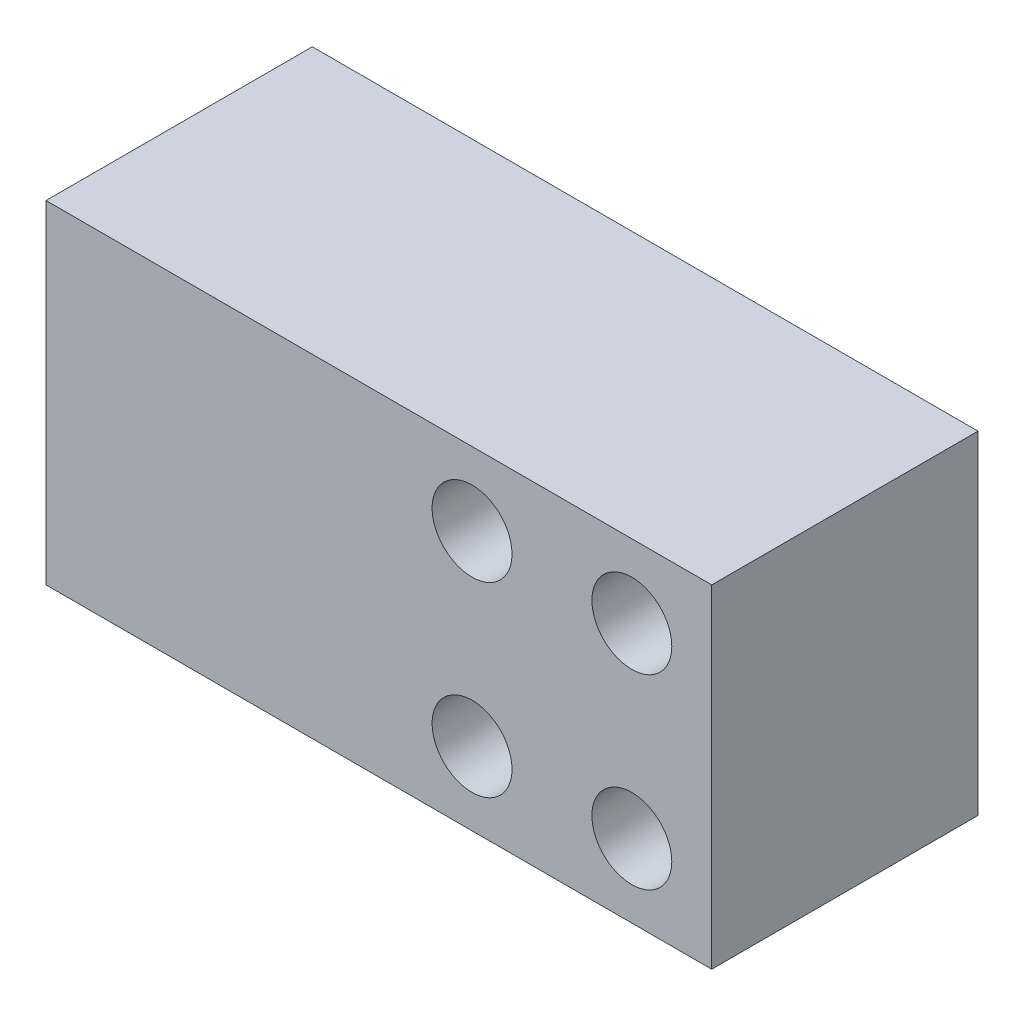
ISO-10303-21;
HEADER;
FILE_DESCRIPTION(('STEP AP214'),'2;1');
FILE_NAME('part.step','',(''),(''),'','','');
FILE_SCHEMA(('AUTOMOTIVE_DESIGN { 1 0 10303 214 1 1 1 1 }'));
ENDSEC;
DATA;
#1=APPLICATION_CONTEXT('core data for automotive mechanical design processes');
#2=APPLICATION_PROTOCOL_DEFINITION('international standard','automotive_design',2000,#1);
#3=PRODUCT_CONTEXT('',#1,'mechanical');
#4=PRODUCT('Part','Part','',(#3));
#5=PRODUCT_RELATED_PRODUCT_CATEGORY('part','',(#4));
#6=PRODUCT_DEFINITION_FORMATION('','',#4);
#7=PRODUCT_DEFINITION_CONTEXT('part definition',#1,'design');
#8=PRODUCT_DEFINITION('design','',#6,#7);
#9=PRODUCT_DEFINITION_SHAPE('','',#8);
#10=(LENGTH_UNIT() NAMED_UNIT(*) SI_UNIT(.MILLI.,.METRE.));
#11=(NAMED_UNIT(*) PLANE_ANGLE_UNIT() SI_UNIT($,.RADIAN.));
#12=(NAMED_UNIT(*) SI_UNIT($,.STERADIAN.) SOLID_ANGLE_UNIT());
#13=UNCERTAINTY_MEASURE_WITH_UNIT(LENGTH_MEASURE(1.E-05),#10,'distance_accuracy_value','');
#14=(GEOMETRIC_REPRESENTATION_CONTEXT(3) GLOBAL_UNCERTAINTY_ASSIGNED_CONTEXT((#13)) GLOBAL_UNIT_ASSIGNED_CONTEXT((#10,
#11,#12)) REPRESENTATION_CONTEXT('',''));
#15=CARTESIAN_POINT('',(0.,0.,0.));
#16=DIRECTION('',(0.,0.,1.));
#17=DIRECTION('',(1.,0.,0.));
#18=AXIS2_PLACEMENT_3D('',#15,#16,#17);
#19=CARTESIAN_POINT('',(0.,0.,20.));
#20=DIRECTION('',(1.,0.,0.));
#21=DIRECTION('',(0.,0.,-1.));
#22=AXIS2_PLACEMENT_3D('',#19,#20,#21);
#23=PLANE('',#22);
#24=DIRECTION('',(0.,-1.,0.));
#25=VECTOR('',#24,1.);
#26=CARTESIAN_POINT('',(0.,0.,0.));
#27=LINE('',#26,#25);
#28=CARTESIAN_POINT('',(0.,0.,0.));
#29=VERTEX_POINT('',#28);
#30=CARTESIAN_POINT('',(0.,-25.,0.));
#31=VERTEX_POINT('',#30);
#32=EDGE_CURVE('E107',#29,#31,#27,.T.);
#33=ORIENTED_EDGE('',*,*,#32,.T.);
#34=DIRECTION('',(0.,0.,-1.));
#35=VECTOR('',#34,1.);
#36=CARTESIAN_POINT('',(0.,-25.,20.));
#37=LINE('',#36,#35);
#38=CARTESIAN_POINT('',(0.,-25.,20.));
#39=VERTEX_POINT('',#38);
#40=EDGE_CURVE('E11',#39,#31,#37,.T.);
#41=ORIENTED_EDGE('',*,*,#40,.F.);
#42=DIRECTION('',(0.,-1.,0.));
#43=VECTOR('',#42,1.);
#44=CARTESIAN_POINT('',(0.,0.,20.));
#45=LINE('',#44,#43);
#46=CARTESIAN_POINT('',(0.,0.,20.));
#47=VERTEX_POINT('',#46);
#48=EDGE_CURVE('E94',#47,#39,#45,.T.);
#49=ORIENTED_EDGE('',*,*,#48,.F.);
#50=DIRECTION('',(0.,0.,-1.));
#51=VECTOR('',#50,1.);
#52=CARTESIAN_POINT('',(0.,0.,20.));
#53=LINE('',#52,#51);
#54=EDGE_CURVE('E103',#47,#29,#53,.T.);
#55=ORIENTED_EDGE('',*,*,#54,.T.);
#56=EDGE_LOOP('',(#33,#41,#49,#55));
#57=FACE_BOUND('',#56,.T.);
#58=ADVANCED_FACE('F41',(#57),#23,.F.);
#59=CARTESIAN_POINT('',(0.,-25.,20.));
#60=DIRECTION('',(0.,1.,0.));
#61=DIRECTION('',(0.,0.,1.));
#62=AXIS2_PLACEMENT_3D('',#59,#60,#61);
#63=PLANE('',#62);
#64=DIRECTION('',(1.,0.,0.));
#65=VECTOR('',#64,1.);
#66=CARTESIAN_POINT('',(0.,-25.,0.));
#67=LINE('',#66,#65);
#68=CARTESIAN_POINT('',(50.,-25.,0.));
#69=VERTEX_POINT('',#68);
#70=EDGE_CURVE('E98',#31,#69,#67,.T.);
#71=ORIENTED_EDGE('',*,*,#70,.T.);
#72=DIRECTION('',(0.,0.,-1.));
#73=VECTOR('',#72,1.);
#74=CARTESIAN_POINT('',(50.,-25.,20.));
#75=LINE('',#74,#73);
#76=CARTESIAN_POINT('',(50.,-25.,20.));
#77=VERTEX_POINT('',#76);
#78=EDGE_CURVE('E50',#77,#69,#75,.T.);
#79=ORIENTED_EDGE('',*,*,#78,.F.);
#80=DIRECTION('',(1.,0.,0.));
#81=VECTOR('',#80,1.);
#82=CARTESIAN_POINT('',(0.,-25.,20.));
#83=LINE('',#82,#81);
#84=EDGE_CURVE('E89',#39,#77,#83,.T.);
#85=ORIENTED_EDGE('',*,*,#84,.F.);
#86=ORIENTED_EDGE('',*,*,#40,.T.);
#87=EDGE_LOOP('',(#71,#79,#85,#86));
#88=FACE_BOUND('',#87,.T.);
#89=ADVANCED_FACE('F97',(#88),#63,.F.);
#90=CARTESIAN_POINT('',(50.,0.,20.));
#91=DIRECTION('',(-1.,0.,0.));
#92=DIRECTION('',(0.,0.,1.));
#93=AXIS2_PLACEMENT_3D('',#90,#91,#92);
#94=PLANE('',#93);
#95=DIRECTION('',(0.,1.,0.));
#96=VECTOR('',#95,1.);
#97=CARTESIAN_POINT('',(50.,0.,0.));
#98=LINE('',#97,#96);
#99=CARTESIAN_POINT('',(50.,0.,0.));
#100=VERTEX_POINT('',#99);
#101=EDGE_CURVE('E76',#69,#100,#98,.T.);
#102=ORIENTED_EDGE('',*,*,#101,.T.);
#103=DIRECTION('',(0.,0.,-1.));
#104=VECTOR('',#103,1.);
#105=CARTESIAN_POINT('',(50.,0.,20.));
#106=LINE('',#105,#104);
#107=CARTESIAN_POINT('',(50.,0.,20.));
#108=VERTEX_POINT('',#107);
#109=EDGE_CURVE('E99',#108,#100,#106,.T.);
#110=ORIENTED_EDGE('',*,*,#109,.F.);
#111=DIRECTION('',(0.,1.,0.));
#112=VECTOR('',#111,1.);
#113=CARTESIAN_POINT('',(50.,0.,20.));
#114=LINE('',#113,#112);
#115=EDGE_CURVE('E92',#77,#108,#114,.T.);
#116=ORIENTED_EDGE('',*,*,#115,.F.);
#117=ORIENTED_EDGE('',*,*,#78,.T.);
#118=EDGE_LOOP('',(#102,#110,#116,#117));
#119=FACE_BOUND('',#118,.T.);
#120=ADVANCED_FACE('F101',(#119),#94,.F.);
#121=CARTESIAN_POINT('',(0.,0.,20.));
#122=DIRECTION('',(0.,-1.,0.));
#123=DIRECTION('',(0.,0.,-1.));
#124=AXIS2_PLACEMENT_3D('',#121,#122,#123);
#125=PLANE('',#124);
#126=DIRECTION('',(-1.,0.,0.));
#127=VECTOR('',#126,1.);
#128=CARTESIAN_POINT('',(0.,0.,0.));
#129=LINE('',#128,#127);
#130=EDGE_CURVE('E82',#100,#29,#129,.T.);
#131=ORIENTED_EDGE('',*,*,#130,.T.);
#132=ORIENTED_EDGE('',*,*,#54,.F.);
#133=DIRECTION('',(-1.,0.,0.));
#134=VECTOR('',#133,1.);
#135=CARTESIAN_POINT('',(0.,0.,20.));
#136=LINE('',#135,#134);
#137=EDGE_CURVE('E59',#108,#47,#136,.T.);
#138=ORIENTED_EDGE('',*,*,#137,.F.);
#139=ORIENTED_EDGE('',*,*,#109,.T.);
#140=EDGE_LOOP('',(#131,#132,#138,#139));
#141=FACE_BOUND('',#140,.T.);
#142=ADVANCED_FACE('F158',(#141),#125,.F.);
#143=CARTESIAN_POINT('',(0.,0.,20.));
#144=DIRECTION('',(0.,0.,1.));
#145=DIRECTION('',(1.,0.,0.));
#146=AXIS2_PLACEMENT_3D('',#143,#144,#145);
#147=PLANE('',#146);
#148=CARTESIAN_POINT('',(43.9999999999999,-19.5,20.));
#149=DIRECTION('',(0.,0.,1.));
#150=DIRECTION('',(-1.,0.,0.));
#151=AXIS2_PLACEMENT_3D('',#148,#149,#150);
#152=CIRCLE('',#151,3.);
#153=CARTESIAN_POINT('',(46.9999999999999,-19.5,20.));
#154=VERTEX_POINT('',#153);
#155=EDGE_CURVE('E227',#154,#154,#152,.T.);
#156=ORIENTED_EDGE('',*,*,#155,.F.);
#157=EDGE_LOOP('',(#156));
#158=FACE_BOUND('',#157,.T.);
#159=CARTESIAN_POINT('',(31.9999999999999,-5.50000000000009,20.));
#160=DIRECTION('',(0.,0.,1.));
#161=DIRECTION('',(1.,0.,0.));
#162=AXIS2_PLACEMENT_3D('',#159,#160,#161);
#163=CIRCLE('',#162,3.00000000000001);
#164=CARTESIAN_POINT('',(34.9999999999999,-5.50000000000009,20.));
#165=VERTEX_POINT('',#164);
#166=EDGE_CURVE('E222',#165,#165,#163,.T.);
#167=ORIENTED_EDGE('',*,*,#166,.F.);
#168=EDGE_LOOP('',(#167));
#169=FACE_BOUND('',#168,.T.);
#170=CARTESIAN_POINT('',(31.9999999999999,-19.4999999999999,20.));
#171=DIRECTION('',(0.,0.,1.));
#172=DIRECTION('',(-1.,0.,0.));
#173=AXIS2_PLACEMENT_3D('',#170,#171,#172);
#174=CIRCLE('',#173,3.00000000000001);
#175=CARTESIAN_POINT('',(34.9999999999999,-19.4999999999999,20.));
#176=VERTEX_POINT('',#175);
#177=EDGE_CURVE('E215',#176,#176,#174,.T.);
#178=ORIENTED_EDGE('',*,*,#177,.F.);
#179=EDGE_LOOP('',(#178));
#180=FACE_BOUND('',#179,.T.);
#181=CARTESIAN_POINT('',(43.9999999999999,-5.5,20.));
#182=DIRECTION('',(0.,0.,1.));
#183=DIRECTION('',(1.,0.,0.));
#184=AXIS2_PLACEMENT_3D('',#181,#182,#183);
#185=CIRCLE('',#184,3.);
#186=CARTESIAN_POINT('',(46.9999999999999,-5.5,20.));
#187=VERTEX_POINT('',#186);
#188=EDGE_CURVE('E119',#187,#187,#185,.T.);
#189=ORIENTED_EDGE('',*,*,#188,.F.);
#190=EDGE_LOOP('',(#189));
#191=FACE_BOUND('',#190,.T.);
#192=ORIENTED_EDGE('',*,*,#48,.T.);
#193=ORIENTED_EDGE('',*,*,#84,.T.);
#194=ORIENTED_EDGE('',*,*,#115,.T.);
#195=ORIENTED_EDGE('',*,*,#137,.T.);
#196=EDGE_LOOP('',(#192,#193,#194,#195));
#197=FACE_BOUND('',#196,.T.);
#198=ADVANCED_FACE('F90',(#158,#169,#180,#191,#197),#147,.T.);
#199=CARTESIAN_POINT('',(0.,0.,0.));
#200=DIRECTION('',(0.,0.,1.));
#201=DIRECTION('',(1.,0.,0.));
#202=AXIS2_PLACEMENT_3D('',#199,#200,#201);
#203=PLANE('',#202);
#204=CARTESIAN_POINT('',(43.9999999999999,-19.5,0.));
#205=DIRECTION('',(0.,0.,1.));
#206=DIRECTION('',(1.,0.,0.));
#207=AXIS2_PLACEMENT_3D('',#204,#205,#206);
#208=CIRCLE('',#207,3.);
#209=CARTESIAN_POINT('',(46.9999999999999,-19.5,0.));
#210=VERTEX_POINT('',#209);
#211=EDGE_CURVE('E44',#210,#210,#208,.T.);
#212=ORIENTED_EDGE('',*,*,#211,.T.);
#213=EDGE_LOOP('',(#212));
#214=FACE_BOUND('',#213,.T.);
#215=CARTESIAN_POINT('',(31.9999999999999,-5.50000000000009,0.));
#216=DIRECTION('',(0.,0.,1.));
#217=DIRECTION('',(1.,0.,0.));
#218=AXIS2_PLACEMENT_3D('',#215,#216,#217);
#219=CIRCLE('',#218,3.00000000000001);
#220=CARTESIAN_POINT('',(34.9999999999999,-5.50000000000009,0.));
#221=VERTEX_POINT('',#220);
#222=EDGE_CURVE('E121',#221,#221,#219,.T.);
#223=ORIENTED_EDGE('',*,*,#222,.T.);
#224=EDGE_LOOP('',(#223));
#225=FACE_BOUND('',#224,.T.);
#226=CARTESIAN_POINT('',(31.9999999999999,-19.4999999999999,0.));
#227=DIRECTION('',(0.,0.,1.));
#228=DIRECTION('',(1.,0.,0.));
#229=AXIS2_PLACEMENT_3D('',#226,#227,#228);
#230=CIRCLE('',#229,3.00000000000001);
#231=CARTESIAN_POINT('',(34.9999999999999,-19.4999999999999,0.));
#232=VERTEX_POINT('',#231);
#233=EDGE_CURVE('E118',#232,#232,#230,.T.);
#234=ORIENTED_EDGE('',*,*,#233,.T.);
#235=EDGE_LOOP('',(#234));
#236=FACE_BOUND('',#235,.T.);
#237=CARTESIAN_POINT('',(43.9999999999999,-5.5,0.));
#238=DIRECTION('',(0.,0.,1.));
#239=DIRECTION('',(1.,0.,0.));
#240=AXIS2_PLACEMENT_3D('',#237,#238,#239);
#241=CIRCLE('',#240,3.);
#242=CARTESIAN_POINT('',(46.9999999999999,-5.5,0.));
#243=VERTEX_POINT('',#242);
#244=EDGE_CURVE('E115',#243,#243,#241,.T.);
#245=ORIENTED_EDGE('',*,*,#244,.T.);
#246=EDGE_LOOP('',(#245));
#247=FACE_BOUND('',#246,.T.);
#248=ORIENTED_EDGE('',*,*,#32,.F.);
#249=ORIENTED_EDGE('',*,*,#130,.F.);
#250=ORIENTED_EDGE('',*,*,#101,.F.);
#251=ORIENTED_EDGE('',*,*,#70,.F.);
#252=EDGE_LOOP('',(#248,#249,#250,#251));
#253=FACE_BOUND('',#252,.T.);
#254=ADVANCED_FACE('F128',(#214,#225,#236,#247,#253),#203,.F.);
#255=CARTESIAN_POINT('',(43.9999999999999,-5.5,-25.));
#256=DIRECTION('',(0.,0.,1.));
#257=DIRECTION('',(1.,0.,0.));
#258=AXIS2_PLACEMENT_3D('',#255,#256,#257);
#259=CYLINDRICAL_SURFACE('',#258,3.);
#260=CARTESIAN_POINT('',(46.9999999999999,-5.5,20.));
#261=CARTESIAN_POINT('',(46.9999999999999,-5.5,19.7916666666667));
#262=CARTESIAN_POINT('',(46.9999999999999,-5.5,19.5833333333333));
#263=CARTESIAN_POINT('',(46.9999999999999,-5.5,19.1666666666667));
#264=CARTESIAN_POINT('',(46.9999999999999,-5.5,18.9583333333333));
#265=CARTESIAN_POINT('',(46.9999999999999,-5.5,18.5416666666667));
#266=CARTESIAN_POINT('',(46.9999999999999,-5.5,18.3333333333333));
#267=CARTESIAN_POINT('',(46.9999999999999,-5.5,17.9166666666667));
#268=CARTESIAN_POINT('',(46.9999999999999,-5.5,17.7083333333333));
#269=CARTESIAN_POINT('',(46.9999999999999,-5.5,17.2916666666667));
#270=CARTESIAN_POINT('',(46.9999999999999,-5.5,17.0833333333333));
#271=CARTESIAN_POINT('',(46.9999999999999,-5.5,16.6666666666667));
#272=CARTESIAN_POINT('',(46.9999999999999,-5.5,16.4583333333333));
#273=CARTESIAN_POINT('',(46.9999999999999,-5.5,16.0416666666667));
#274=CARTESIAN_POINT('',(46.9999999999999,-5.5,15.8333333333333));
#275=CARTESIAN_POINT('',(46.9999999999999,-5.5,15.4166666666667));
#276=CARTESIAN_POINT('',(46.9999999999999,-5.5,15.2083333333333));
#277=CARTESIAN_POINT('',(46.9999999999999,-5.5,14.7916666666667));
#278=CARTESIAN_POINT('',(46.9999999999999,-5.5,14.5833333333333));
#279=CARTESIAN_POINT('',(46.9999999999999,-5.5,14.1666666666667));
#280=CARTESIAN_POINT('',(46.9999999999999,-5.5,13.9583333333333));
#281=CARTESIAN_POINT('',(46.9999999999999,-5.5,13.5416666666667));
#282=CARTESIAN_POINT('',(46.9999999999999,-5.5,13.3333333333333));
#283=CARTESIAN_POINT('',(46.9999999999999,-5.5,12.9166666666667));
#284=CARTESIAN_POINT('',(46.9999999999999,-5.5,12.7083333333333));
#285=CARTESIAN_POINT('',(46.9999999999999,-5.5,12.2916666666667));
#286=CARTESIAN_POINT('',(46.9999999999999,-5.5,12.0833333333333));
#287=CARTESIAN_POINT('',(46.9999999999999,-5.5,11.6666666666667));
#288=CARTESIAN_POINT('',(46.9999999999999,-5.5,11.4583333333333));
#289=CARTESIAN_POINT('',(46.9999999999999,-5.5,11.0416666666667));
#290=CARTESIAN_POINT('',(46.9999999999999,-5.5,10.8333333333333));
#291=CARTESIAN_POINT('',(46.9999999999999,-5.5,10.4166666666667));
#292=CARTESIAN_POINT('',(46.9999999999999,-5.5,10.2083333333333));
#293=CARTESIAN_POINT('',(46.9999999999999,-5.5,9.79166666666667));
#294=CARTESIAN_POINT('',(46.9999999999999,-5.5,9.58333333333333));
#295=CARTESIAN_POINT('',(46.9999999999999,-5.5,9.16666666666666));
#296=CARTESIAN_POINT('',(46.9999999999999,-5.5,8.95833333333333));
#297=CARTESIAN_POINT('',(46.9999999999999,-5.5,8.54166666666666));
#298=CARTESIAN_POINT('',(46.9999999999999,-5.5,8.33333333333333));
#299=CARTESIAN_POINT('',(46.9999999999999,-5.5,7.91666666666666));
#300=CARTESIAN_POINT('',(46.9999999999999,-5.5,7.70833333333333));
#301=CARTESIAN_POINT('',(46.9999999999999,-5.5,7.29166666666666));
#302=CARTESIAN_POINT('',(46.9999999999999,-5.5,7.08333333333333));
#303=CARTESIAN_POINT('',(46.9999999999999,-5.5,6.66666666666666));
#304=CARTESIAN_POINT('',(46.9999999999999,-5.5,6.45833333333333));
#305=CARTESIAN_POINT('',(46.9999999999999,-5.5,6.04166666666667));
#306=CARTESIAN_POINT('',(46.9999999999999,-5.5,5.83333333333334));
#307=CARTESIAN_POINT('',(46.9999999999999,-5.5,5.41666666666667));
#308=CARTESIAN_POINT('',(46.9999999999999,-5.5,5.20833333333333));
#309=CARTESIAN_POINT('',(46.9999999999999,-5.5,4.79166666666667));
#310=CARTESIAN_POINT('',(46.9999999999999,-5.5,4.58333333333333));
#311=CARTESIAN_POINT('',(46.9999999999999,-5.5,4.16666666666667));
#312=CARTESIAN_POINT('',(46.9999999999999,-5.5,3.95833333333333));
#313=CARTESIAN_POINT('',(46.9999999999999,-5.5,3.54166666666667));
#314=CARTESIAN_POINT('',(46.9999999999999,-5.5,3.33333333333333));
#315=CARTESIAN_POINT('',(46.9999999999999,-5.5,2.91666666666667));
#316=CARTESIAN_POINT('',(46.9999999999999,-5.5,2.70833333333333));
#317=CARTESIAN_POINT('',(46.9999999999999,-5.5,2.29166666666667));
#318=CARTESIAN_POINT('',(46.9999999999999,-5.5,2.08333333333334));
#319=CARTESIAN_POINT('',(46.9999999999999,-5.5,1.66666666666667));
#320=CARTESIAN_POINT('',(46.9999999999999,-5.5,1.45833333333333));
#321=CARTESIAN_POINT('',(46.9999999999999,-5.5,1.04166666666667));
#322=CARTESIAN_POINT('',(46.9999999999999,-5.5,0.833333333333334));
#323=CARTESIAN_POINT('',(46.9999999999999,-5.5,0.416666666666667));
#324=CARTESIAN_POINT('',(46.9999999999999,-5.5,0.208333333333334));
#325=CARTESIAN_POINT('',(46.9999999999999,-5.5,0.));
#326=B_SPLINE_CURVE_WITH_KNOTS('',3,(#260,#261,#262,#263,#264,#265,#266,#267,#268,#269,#270,
#271,#272,#273,#274,#275,#276,#277,#278,#279,#280,#281,#282,#283,#284,#285,#286,#287,#288,#289,
#290,#291,#292,#293,#294,#295,#296,#297,#298,#299,#300,#301,#302,#303,#304,#305,#306,#307,#308,
#309,#310,#311,#312,#313,#314,#315,#316,#317,#318,#319,#320,#321,#322,#323,#324,#325),
.UNSPECIFIED.,.F.,.F.,(4,2,2,2,2,2,2,2,2,2,2,2,2,2,2,2,2,2,2,2,2,2,2,2,2,2,2,2,2,2,2,2,4),(0.,
0.625000000000001,1.25,1.875,2.5,3.125,3.75,4.375,5.,5.62500000000001,6.25,6.875,7.5,8.125,8.75,
9.375,10.,10.625,11.25,11.875,12.5,13.125,13.75,14.375,15.,15.625,16.25,16.875,17.5,18.125,
18.75,19.375,20.),.UNSPECIFIED.);
#327=EDGE_CURVE('BSEAM151',#187,#243,#326,.T.);
#328=ORIENTED_EDGE('',*,*,#188,.T.);
#329=ORIENTED_EDGE('',*,*,#244,.F.);
#330=ORIENTED_EDGE('',*,*,#327,.T.);
#331=ORIENTED_EDGE('',*,*,#327,.F.);
#332=EDGE_LOOP('',(#328,#330,#329,#331));
#333=FACE_BOUND('',#332,.T.);
#334=ADVANCED_FACE('F151',(#333),#259,.F.);
#335=CARTESIAN_POINT('',(31.9999999999999,-19.4999999999999,-25.));
#336=DIRECTION('',(0.,0.,1.));
#337=DIRECTION('',(1.,0.,0.));
#338=AXIS2_PLACEMENT_3D('',#335,#336,#337);
#339=CYLINDRICAL_SURFACE('',#338,3.00000000000001);
#340=CARTESIAN_POINT('',(34.9999999999999,-19.4999999999999,20.));
#341=CARTESIAN_POINT('',(34.9999999999999,-19.4999999999999,19.7916666666667));
#342=CARTESIAN_POINT('',(34.9999999999999,-19.4999999999999,19.5833333333333));
#343=CARTESIAN_POINT('',(34.9999999999999,-19.4999999999999,19.1666666666667));
#344=CARTESIAN_POINT('',(34.9999999999999,-19.4999999999999,18.9583333333333));
#345=CARTESIAN_POINT('',(34.9999999999999,-19.4999999999999,18.5416666666667));
#346=CARTESIAN_POINT('',(34.9999999999999,-19.4999999999999,18.3333333333333));
#347=CARTESIAN_POINT('',(34.9999999999999,-19.4999999999999,17.9166666666667));
#348=CARTESIAN_POINT('',(34.9999999999999,-19.4999999999999,17.7083333333333));
#349=CARTESIAN_POINT('',(34.9999999999999,-19.4999999999999,17.2916666666667));
#350=CARTESIAN_POINT('',(34.9999999999999,-19.4999999999999,17.0833333333333));
#351=CARTESIAN_POINT('',(34.9999999999999,-19.4999999999999,16.6666666666667));
#352=CARTESIAN_POINT('',(34.9999999999999,-19.4999999999999,16.4583333333333));
#353=CARTESIAN_POINT('',(34.9999999999999,-19.4999999999999,16.0416666666667));
#354=CARTESIAN_POINT('',(34.9999999999999,-19.4999999999999,15.8333333333333));
#355=CARTESIAN_POINT('',(34.9999999999999,-19.4999999999999,15.4166666666667));
#356=CARTESIAN_POINT('',(34.9999999999999,-19.4999999999999,15.2083333333333));
#357=CARTESIAN_POINT('',(34.9999999999999,-19.4999999999999,14.7916666666667));
#358=CARTESIAN_POINT('',(34.9999999999999,-19.4999999999999,14.5833333333333));
#359=CARTESIAN_POINT('',(34.9999999999999,-19.4999999999999,14.1666666666667));
#360=CARTESIAN_POINT('',(34.9999999999999,-19.4999999999999,13.9583333333333));
#361=CARTESIAN_POINT('',(34.9999999999999,-19.4999999999999,13.5416666666667));
#362=CARTESIAN_POINT('',(34.9999999999999,-19.4999999999999,13.3333333333333));
#363=CARTESIAN_POINT('',(34.9999999999999,-19.4999999999999,12.9166666666667));
#364=CARTESIAN_POINT('',(34.9999999999999,-19.4999999999999,12.7083333333333));
#365=CARTESIAN_POINT('',(34.9999999999999,-19.4999999999999,12.2916666666667));
#366=CARTESIAN_POINT('',(34.9999999999999,-19.4999999999999,12.0833333333333));
#367=CARTESIAN_POINT('',(34.9999999999999,-19.4999999999999,11.6666666666667));
#368=CARTESIAN_POINT('',(34.9999999999999,-19.4999999999999,11.4583333333333));
#369=CARTESIAN_POINT('',(34.9999999999999,-19.4999999999999,11.0416666666667));
#370=CARTESIAN_POINT('',(34.9999999999999,-19.4999999999999,10.8333333333333));
#371=CARTESIAN_POINT('',(34.9999999999999,-19.4999999999999,10.4166666666667));
#372=CARTESIAN_POINT('',(34.9999999999999,-19.4999999999999,10.2083333333333));
#373=CARTESIAN_POINT('',(34.9999999999999,-19.4999999999999,9.79166666666667));
#374=CARTESIAN_POINT('',(34.9999999999999,-19.4999999999999,9.58333333333333));
#375=CARTESIAN_POINT('',(34.9999999999999,-19.4999999999999,9.16666666666666));
#376=CARTESIAN_POINT('',(34.9999999999999,-19.4999999999999,8.95833333333333));
#377=CARTESIAN_POINT('',(34.9999999999999,-19.4999999999999,8.54166666666666));
#378=CARTESIAN_POINT('',(34.9999999999999,-19.4999999999999,8.33333333333333));
#379=CARTESIAN_POINT('',(34.9999999999999,-19.4999999999999,7.91666666666666));
#380=CARTESIAN_POINT('',(34.9999999999999,-19.4999999999999,7.70833333333333));
#381=CARTESIAN_POINT('',(34.9999999999999,-19.4999999999999,7.29166666666666));
#382=CARTESIAN_POINT('',(34.9999999999999,-19.4999999999999,7.08333333333333));
#383=CARTESIAN_POINT('',(34.9999999999999,-19.4999999999999,6.66666666666666));
#384=CARTESIAN_POINT('',(34.9999999999999,-19.4999999999999,6.45833333333333));
#385=CARTESIAN_POINT('',(34.9999999999999,-19.4999999999999,6.04166666666667));
#386=CARTESIAN_POINT('',(34.9999999999999,-19.4999999999999,5.83333333333334));
#387=CARTESIAN_POINT('',(34.9999999999999,-19.4999999999999,5.41666666666667));
#388=CARTESIAN_POINT('',(34.9999999999999,-19.4999999999999,5.20833333333333));
#389=CARTESIAN_POINT('',(34.9999999999999,-19.4999999999999,4.79166666666667));
#390=CARTESIAN_POINT('',(34.9999999999999,-19.4999999999999,4.58333333333333));
#391=CARTESIAN_POINT('',(34.9999999999999,-19.4999999999999,4.16666666666667));
#392=CARTESIAN_POINT('',(34.9999999999999,-19.4999999999999,3.95833333333333));
#393=CARTESIAN_POINT('',(34.9999999999999,-19.4999999999999,3.54166666666667));
#394=CARTESIAN_POINT('',(34.9999999999999,-19.4999999999999,3.33333333333333));
#395=CARTESIAN_POINT('',(34.9999999999999,-19.4999999999999,2.91666666666667));
#396=CARTESIAN_POINT('',(34.9999999999999,-19.4999999999999,2.70833333333333));
#397=CARTESIAN_POINT('',(34.9999999999999,-19.4999999999999,2.29166666666667));
#398=CARTESIAN_POINT('',(34.9999999999999,-19.4999999999999,2.08333333333334));
#399=CARTESIAN_POINT('',(34.9999999999999,-19.4999999999999,1.66666666666667));
#400=CARTESIAN_POINT('',(34.9999999999999,-19.4999999999999,1.45833333333333));
#401=CARTESIAN_POINT('',(34.9999999999999,-19.4999999999999,1.04166666666667));
#402=CARTESIAN_POINT('',(34.9999999999999,-19.4999999999999,0.833333333333334));
#403=CARTESIAN_POINT('',(34.9999999999999,-19.4999999999999,0.416666666666667));
#404=CARTESIAN_POINT('',(34.9999999999999,-19.4999999999999,0.208333333333334));
#405=CARTESIAN_POINT('',(34.9999999999999,-19.4999999999999,0.));
#406=B_SPLINE_CURVE_WITH_KNOTS('',3,(#340,#341,#342,#343,#344,#345,#346,#347,#348,#349,#350,
#351,#352,#353,#354,#355,#356,#357,#358,#359,#360,#361,#362,#363,#364,#365,#366,#367,#368,#369,
#370,#371,#372,#373,#374,#375,#376,#377,#378,#379,#380,#381,#382,#383,#384,#385,#386,#387,#388,
#389,#390,#391,#392,#393,#394,#395,#396,#397,#398,#399,#400,#401,#402,#403,#404,#405),
.UNSPECIFIED.,.F.,.F.,(4,2,2,2,2,2,2,2,2,2,2,2,2,2,2,2,2,2,2,2,2,2,2,2,2,2,2,2,2,2,2,2,4),(0.,
0.625000000000001,1.25,1.875,2.5,3.125,3.75,4.375,5.,5.62500000000001,6.25,6.875,7.5,8.125,8.75,
9.375,10.,10.625,11.25,11.875,12.5,13.125,13.75,14.375,15.,15.625,16.25,16.875,17.5,18.125,
18.75,19.375,20.),.UNSPECIFIED.);
#407=EDGE_CURVE('BSEAM138',#176,#232,#406,.T.);
#408=ORIENTED_EDGE('',*,*,#177,.T.);
#409=ORIENTED_EDGE('',*,*,#233,.F.);
#410=ORIENTED_EDGE('',*,*,#407,.T.);
#411=ORIENTED_EDGE('',*,*,#407,.F.);
#412=EDGE_LOOP('',(#408,#410,#409,#411));
#413=FACE_BOUND('',#412,.T.);
#414=ADVANCED_FACE('F138',(#413),#339,.F.);
#415=CARTESIAN_POINT('',(31.9999999999999,-5.50000000000009,-25.));
#416=DIRECTION('',(0.,0.,1.));
#417=DIRECTION('',(1.,0.,0.));
#418=AXIS2_PLACEMENT_3D('',#415,#416,#417);
#419=CYLINDRICAL_SURFACE('',#418,3.00000000000001);
#420=CARTESIAN_POINT('',(34.9999999999999,-5.50000000000009,20.));
#421=CARTESIAN_POINT('',(34.9999999999999,-5.50000000000009,19.7916666666667));
#422=CARTESIAN_POINT('',(34.9999999999999,-5.50000000000009,19.5833333333333));
#423=CARTESIAN_POINT('',(34.9999999999999,-5.50000000000009,19.1666666666667));
#424=CARTESIAN_POINT('',(34.9999999999999,-5.50000000000009,18.9583333333333));
#425=CARTESIAN_POINT('',(34.9999999999999,-5.50000000000009,18.5416666666667));
#426=CARTESIAN_POINT('',(34.9999999999999,-5.50000000000009,18.3333333333333));
#427=CARTESIAN_POINT('',(34.9999999999999,-5.50000000000009,17.9166666666667));
#428=CARTESIAN_POINT('',(34.9999999999999,-5.50000000000009,17.7083333333333));
#429=CARTESIAN_POINT('',(34.9999999999999,-5.50000000000009,17.2916666666667));
#430=CARTESIAN_POINT('',(34.9999999999999,-5.50000000000009,17.0833333333333));
#431=CARTESIAN_POINT('',(34.9999999999999,-5.50000000000009,16.6666666666667));
#432=CARTESIAN_POINT('',(34.9999999999999,-5.50000000000009,16.4583333333333));
#433=CARTESIAN_POINT('',(34.9999999999999,-5.50000000000009,16.0416666666667));
#434=CARTESIAN_POINT('',(34.9999999999999,-5.50000000000009,15.8333333333333));
#435=CARTESIAN_POINT('',(34.9999999999999,-5.50000000000009,15.4166666666667));
#436=CARTESIAN_POINT('',(34.9999999999999,-5.50000000000009,15.2083333333333));
#437=CARTESIAN_POINT('',(34.9999999999999,-5.50000000000009,14.7916666666667));
#438=CARTESIAN_POINT('',(34.9999999999999,-5.50000000000009,14.5833333333333));
#439=CARTESIAN_POINT('',(34.9999999999999,-5.50000000000009,14.1666666666667));
#440=CARTESIAN_POINT('',(34.9999999999999,-5.50000000000009,13.9583333333333));
#441=CARTESIAN_POINT('',(34.9999999999999,-5.50000000000009,13.5416666666667));
#442=CARTESIAN_POINT('',(34.9999999999999,-5.50000000000009,13.3333333333333));
#443=CARTESIAN_POINT('',(34.9999999999999,-5.50000000000009,12.9166666666667));
#444=CARTESIAN_POINT('',(34.9999999999999,-5.50000000000009,12.7083333333333));
#445=CARTESIAN_POINT('',(34.9999999999999,-5.50000000000009,12.2916666666667));
#446=CARTESIAN_POINT('',(34.9999999999999,-5.50000000000009,12.0833333333333));
#447=CARTESIAN_POINT('',(34.9999999999999,-5.50000000000009,11.6666666666667));
#448=CARTESIAN_POINT('',(34.9999999999999,-5.50000000000009,11.4583333333333));
#449=CARTESIAN_POINT('',(34.9999999999999,-5.50000000000009,11.0416666666667));
#450=CARTESIAN_POINT('',(34.9999999999999,-5.50000000000009,10.8333333333333));
#451=CARTESIAN_POINT('',(34.9999999999999,-5.50000000000009,10.4166666666667));
#452=CARTESIAN_POINT('',(34.9999999999999,-5.50000000000009,10.2083333333333));
#453=CARTESIAN_POINT('',(34.9999999999999,-5.50000000000009,9.79166666666667));
#454=CARTESIAN_POINT('',(34.9999999999999,-5.50000000000009,9.58333333333333));
#455=CARTESIAN_POINT('',(34.9999999999999,-5.50000000000009,9.16666666666666));
#456=CARTESIAN_POINT('',(34.9999999999999,-5.50000000000009,8.95833333333333));
#457=CARTESIAN_POINT('',(34.9999999999999,-5.50000000000009,8.54166666666666));
#458=CARTESIAN_POINT('',(34.9999999999999,-5.50000000000009,8.33333333333333));
#459=CARTESIAN_POINT('',(34.9999999999999,-5.50000000000009,7.91666666666666));
#460=CARTESIAN_POINT('',(34.9999999999999,-5.50000000000009,7.70833333333333));
#461=CARTESIAN_POINT('',(34.9999999999999,-5.50000000000009,7.29166666666666));
#462=CARTESIAN_POINT('',(34.9999999999999,-5.50000000000009,7.08333333333333));
#463=CARTESIAN_POINT('',(34.9999999999999,-5.50000000000009,6.66666666666666));
#464=CARTESIAN_POINT('',(34.9999999999999,-5.50000000000009,6.45833333333333));
#465=CARTESIAN_POINT('',(34.9999999999999,-5.50000000000009,6.04166666666667));
#466=CARTESIAN_POINT('',(34.9999999999999,-5.50000000000009,5.83333333333334));
#467=CARTESIAN_POINT('',(34.9999999999999,-5.50000000000009,5.41666666666667));
#468=CARTESIAN_POINT('',(34.9999999999999,-5.50000000000009,5.20833333333333));
#469=CARTESIAN_POINT('',(34.9999999999999,-5.50000000000009,4.79166666666667));
#470=CARTESIAN_POINT('',(34.9999999999999,-5.50000000000009,4.58333333333333));
#471=CARTESIAN_POINT('',(34.9999999999999,-5.50000000000009,4.16666666666667));
#472=CARTESIAN_POINT('',(34.9999999999999,-5.50000000000009,3.95833333333333));
#473=CARTESIAN_POINT('',(34.9999999999999,-5.50000000000009,3.54166666666667));
#474=CARTESIAN_POINT('',(34.9999999999999,-5.50000000000009,3.33333333333333));
#475=CARTESIAN_POINT('',(34.9999999999999,-5.50000000000009,2.91666666666667));
#476=CARTESIAN_POINT('',(34.9999999999999,-5.50000000000009,2.70833333333333));
#477=CARTESIAN_POINT('',(34.9999999999999,-5.50000000000009,2.29166666666667));
#478=CARTESIAN_POINT('',(34.9999999999999,-5.50000000000009,2.08333333333334));
#479=CARTESIAN_POINT('',(34.9999999999999,-5.50000000000009,1.66666666666667));
#480=CARTESIAN_POINT('',(34.9999999999999,-5.50000000000009,1.45833333333333));
#481=CARTESIAN_POINT('',(34.9999999999999,-5.50000000000009,1.04166666666667));
#482=CARTESIAN_POINT('',(34.9999999999999,-5.50000000000009,0.833333333333334));
#483=CARTESIAN_POINT('',(34.9999999999999,-5.50000000000009,0.416666666666667));
#484=CARTESIAN_POINT('',(34.9999999999999,-5.50000000000009,0.208333333333334));
#485=CARTESIAN_POINT('',(34.9999999999999,-5.50000000000009,0.));
#486=B_SPLINE_CURVE_WITH_KNOTS('',3,(#420,#421,#422,#423,#424,#425,#426,#427,#428,#429,#430,
#431,#432,#433,#434,#435,#436,#437,#438,#439,#440,#441,#442,#443,#444,#445,#446,#447,#448,#449,
#450,#451,#452,#453,#454,#455,#456,#457,#458,#459,#460,#461,#462,#463,#464,#465,#466,#467,#468,
#469,#470,#471,#472,#473,#474,#475,#476,#477,#478,#479,#480,#481,#482,#483,#484,#485),
.UNSPECIFIED.,.F.,.F.,(4,2,2,2,2,2,2,2,2,2,2,2,2,2,2,2,2,2,2,2,2,2,2,2,2,2,2,2,2,2,2,2,4),(0.,
0.625000000000001,1.25,1.875,2.5,3.125,3.75,4.375,5.,5.62500000000001,6.25,6.875,7.5,8.125,8.75,
9.375,10.,10.625,11.25,11.875,12.5,13.125,13.75,14.375,15.,15.625,16.25,16.875,17.5,18.125,
18.75,19.375,20.),.UNSPECIFIED.);
#487=EDGE_CURVE('BSEAM132',#165,#221,#486,.T.);
#488=ORIENTED_EDGE('',*,*,#166,.T.);
#489=ORIENTED_EDGE('',*,*,#222,.F.);
#490=ORIENTED_EDGE('',*,*,#487,.T.);
#491=ORIENTED_EDGE('',*,*,#487,.F.);
#492=EDGE_LOOP('',(#488,#490,#489,#491));
#493=FACE_BOUND('',#492,.T.);
#494=ADVANCED_FACE('F132',(#493),#419,.F.);
#495=CARTESIAN_POINT('',(43.9999999999999,-19.5,-25.));
#496=DIRECTION('',(0.,0.,1.));
#497=DIRECTION('',(1.,0.,0.));
#498=AXIS2_PLACEMENT_3D('',#495,#496,#497);
#499=CYLINDRICAL_SURFACE('',#498,3.);
#500=CARTESIAN_POINT('',(46.9999999999999,-19.5,20.));
#501=CARTESIAN_POINT('',(46.9999999999999,-19.5,19.7916666666667));
#502=CARTESIAN_POINT('',(46.9999999999999,-19.5,19.5833333333333));
#503=CARTESIAN_POINT('',(46.9999999999999,-19.5,19.1666666666667));
#504=CARTESIAN_POINT('',(46.9999999999999,-19.5,18.9583333333333));
#505=CARTESIAN_POINT('',(46.9999999999999,-19.5,18.5416666666667));
#506=CARTESIAN_POINT('',(46.9999999999999,-19.5,18.3333333333333));
#507=CARTESIAN_POINT('',(46.9999999999999,-19.5,17.9166666666667));
#508=CARTESIAN_POINT('',(46.9999999999999,-19.5,17.7083333333333));
#509=CARTESIAN_POINT('',(46.9999999999999,-19.5,17.2916666666667));
#510=CARTESIAN_POINT('',(46.9999999999999,-19.5,17.0833333333333));
#511=CARTESIAN_POINT('',(46.9999999999999,-19.5,16.6666666666667));
#512=CARTESIAN_POINT('',(46.9999999999999,-19.5,16.4583333333333));
#513=CARTESIAN_POINT('',(46.9999999999999,-19.5,16.0416666666667));
#514=CARTESIAN_POINT('',(46.9999999999999,-19.5,15.8333333333333));
#515=CARTESIAN_POINT('',(46.9999999999999,-19.5,15.4166666666667));
#516=CARTESIAN_POINT('',(46.9999999999999,-19.5,15.2083333333333));
#517=CARTESIAN_POINT('',(46.9999999999999,-19.5,14.7916666666667));
#518=CARTESIAN_POINT('',(46.9999999999999,-19.5,14.5833333333333));
#519=CARTESIAN_POINT('',(46.9999999999999,-19.5,14.1666666666667));
#520=CARTESIAN_POINT('',(46.9999999999999,-19.5,13.9583333333333));
#521=CARTESIAN_POINT('',(46.9999999999999,-19.5,13.5416666666667));
#522=CARTESIAN_POINT('',(46.9999999999999,-19.5,13.3333333333333));
#523=CARTESIAN_POINT('',(46.9999999999999,-19.5,12.9166666666667));
#524=CARTESIAN_POINT('',(46.9999999999999,-19.5,12.7083333333333));
#525=CARTESIAN_POINT('',(46.9999999999999,-19.5,12.2916666666667));
#526=CARTESIAN_POINT('',(46.9999999999999,-19.5,12.0833333333333));
#527=CARTESIAN_POINT('',(46.9999999999999,-19.5,11.6666666666667));
#528=CARTESIAN_POINT('',(46.9999999999999,-19.5,11.4583333333333));
#529=CARTESIAN_POINT('',(46.9999999999999,-19.5,11.0416666666667));
#530=CARTESIAN_POINT('',(46.9999999999999,-19.5,10.8333333333333));
#531=CARTESIAN_POINT('',(46.9999999999999,-19.5,10.4166666666667));
#532=CARTESIAN_POINT('',(46.9999999999999,-19.5,10.2083333333333));
#533=CARTESIAN_POINT('',(46.9999999999999,-19.5,9.79166666666667));
#534=CARTESIAN_POINT('',(46.9999999999999,-19.5,9.58333333333333));
#535=CARTESIAN_POINT('',(46.9999999999999,-19.5,9.16666666666666));
#536=CARTESIAN_POINT('',(46.9999999999999,-19.5,8.95833333333333));
#537=CARTESIAN_POINT('',(46.9999999999999,-19.5,8.54166666666666));
#538=CARTESIAN_POINT('',(46.9999999999999,-19.5,8.33333333333333));
#539=CARTESIAN_POINT('',(46.9999999999999,-19.5,7.91666666666666));
#540=CARTESIAN_POINT('',(46.9999999999999,-19.5,7.70833333333333));
#541=CARTESIAN_POINT('',(46.9999999999999,-19.5,7.29166666666666));
#542=CARTESIAN_POINT('',(46.9999999999999,-19.5,7.08333333333333));
#543=CARTESIAN_POINT('',(46.9999999999999,-19.5,6.66666666666666));
#544=CARTESIAN_POINT('',(46.9999999999999,-19.5,6.45833333333333));
#545=CARTESIAN_POINT('',(46.9999999999999,-19.5,6.04166666666667));
#546=CARTESIAN_POINT('',(46.9999999999999,-19.5,5.83333333333334));
#547=CARTESIAN_POINT('',(46.9999999999999,-19.5,5.41666666666667));
#548=CARTESIAN_POINT('',(46.9999999999999,-19.5,5.20833333333333));
#549=CARTESIAN_POINT('',(46.9999999999999,-19.5,4.79166666666667));
#550=CARTESIAN_POINT('',(46.9999999999999,-19.5,4.58333333333333));
#551=CARTESIAN_POINT('',(46.9999999999999,-19.5,4.16666666666667));
#552=CARTESIAN_POINT('',(46.9999999999999,-19.5,3.95833333333333));
#553=CARTESIAN_POINT('',(46.9999999999999,-19.5,3.54166666666667));
#554=CARTESIAN_POINT('',(46.9999999999999,-19.5,3.33333333333333));
#555=CARTESIAN_POINT('',(46.9999999999999,-19.5,2.91666666666667));
#556=CARTESIAN_POINT('',(46.9999999999999,-19.5,2.70833333333333));
#557=CARTESIAN_POINT('',(46.9999999999999,-19.5,2.29166666666667));
#558=CARTESIAN_POINT('',(46.9999999999999,-19.5,2.08333333333334));
#559=CARTESIAN_POINT('',(46.9999999999999,-19.5,1.66666666666667));
#560=CARTESIAN_POINT('',(46.9999999999999,-19.5,1.45833333333333));
#561=CARTESIAN_POINT('',(46.9999999999999,-19.5,1.04166666666667));
#562=CARTESIAN_POINT('',(46.9999999999999,-19.5,0.833333333333334));
#563=CARTESIAN_POINT('',(46.9999999999999,-19.5,0.416666666666667));
#564=CARTESIAN_POINT('',(46.9999999999999,-19.5,0.208333333333334));
#565=CARTESIAN_POINT('',(46.9999999999999,-19.5,0.));
#566=B_SPLINE_CURVE_WITH_KNOTS('',3,(#500,#501,#502,#503,#504,#505,#506,#507,#508,#509,#510,
#511,#512,#513,#514,#515,#516,#517,#518,#519,#520,#521,#522,#523,#524,#525,#526,#527,#528,#529,
#530,#531,#532,#533,#534,#535,#536,#537,#538,#539,#540,#541,#542,#543,#544,#545,#546,#547,#548,
#549,#550,#551,#552,#553,#554,#555,#556,#557,#558,#559,#560,#561,#562,#563,#564,#565),
.UNSPECIFIED.,.F.,.F.,(4,2,2,2,2,2,2,2,2,2,2,2,2,2,2,2,2,2,2,2,2,2,2,2,2,2,2,2,2,2,2,2,4),(0.,
0.625000000000001,1.25,1.875,2.5,3.125,3.75,4.375,5.,5.62500000000001,6.25,6.875,7.5,8.125,8.75,
9.375,10.,10.625,11.25,11.875,12.5,13.125,13.75,14.375,15.,15.625,16.25,16.875,17.5,18.125,
18.75,19.375,20.),.UNSPECIFIED.);
#567=EDGE_CURVE('BSEAM130',#154,#210,#566,.T.);
#568=ORIENTED_EDGE('',*,*,#155,.T.);
#569=ORIENTED_EDGE('',*,*,#211,.F.);
#570=ORIENTED_EDGE('',*,*,#567,.T.);
#571=ORIENTED_EDGE('',*,*,#567,.F.);
#572=EDGE_LOOP('',(#568,#570,#569,#571));
#573=FACE_BOUND('',#572,.T.);
#574=ADVANCED_FACE('F130',(#573),#499,.F.);
#575=CLOSED_SHELL('',(#58,#89,#120,#142,#198,#254,#334,#414,#494,#574));
#576=MANIFOLD_SOLID_BREP('B2',#575);
#577=ADVANCED_BREP_SHAPE_REPRESENTATION('',(#18,#576),#14);
#578=SHAPE_DEFINITION_REPRESENTATION(#9,#577);
ENDSEC;
END-ISO-10303-21;
